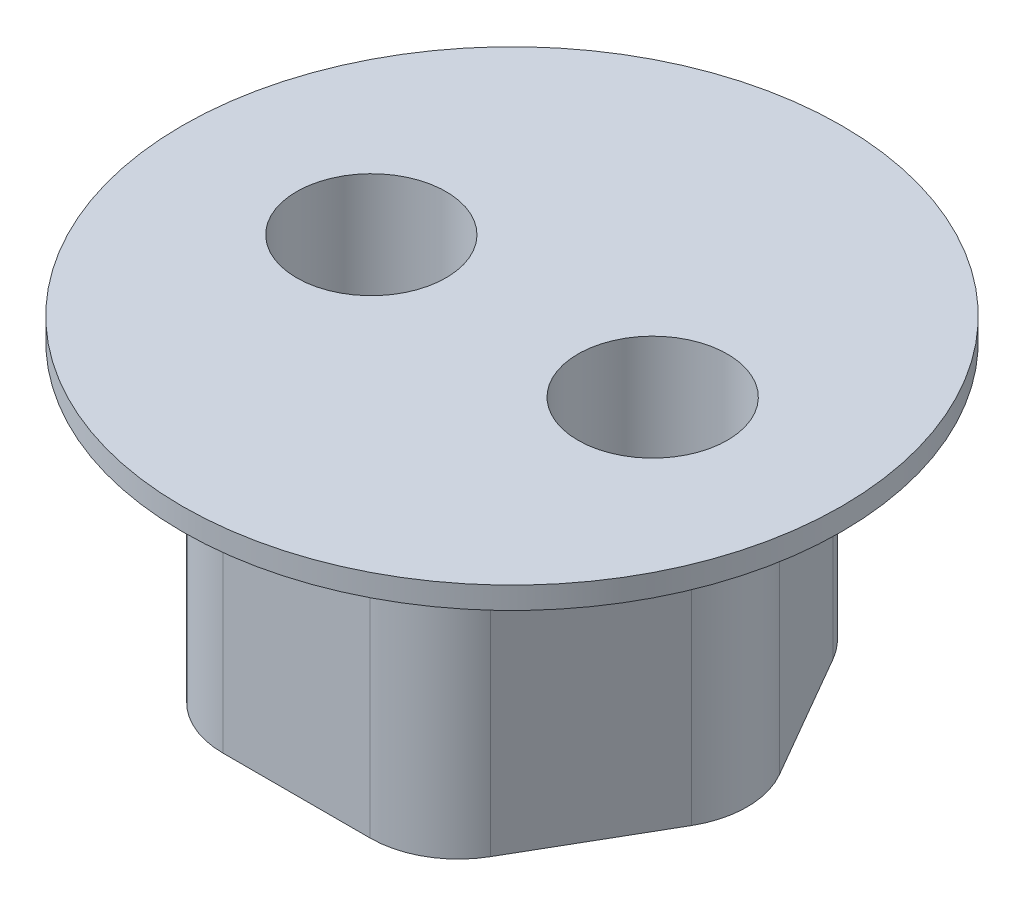
ISO-10303-21;
HEADER;
FILE_DESCRIPTION(('STEP AP214'),'2;1');
FILE_NAME('part.step','',(''),(''),'','','');
FILE_SCHEMA(('AUTOMOTIVE_DESIGN { 1 0 10303 214 1 1 1 1 }'));
ENDSEC;
DATA;
#1=APPLICATION_CONTEXT('core data for automotive mechanical design processes');
#2=APPLICATION_PROTOCOL_DEFINITION('international standard','automotive_design',2000,#1);
#3=PRODUCT_CONTEXT('',#1,'mechanical');
#4=PRODUCT('Part','Part','',(#3));
#5=PRODUCT_RELATED_PRODUCT_CATEGORY('part','',(#4));
#6=PRODUCT_DEFINITION_FORMATION('','',#4);
#7=PRODUCT_DEFINITION_CONTEXT('part definition',#1,'design');
#8=PRODUCT_DEFINITION('design','',#6,#7);
#9=PRODUCT_DEFINITION_SHAPE('','',#8);
#10=(LENGTH_UNIT() NAMED_UNIT(*) SI_UNIT(.MILLI.,.METRE.));
#11=(NAMED_UNIT(*) PLANE_ANGLE_UNIT() SI_UNIT($,.RADIAN.));
#12=(NAMED_UNIT(*) SI_UNIT($,.STERADIAN.) SOLID_ANGLE_UNIT());
#13=UNCERTAINTY_MEASURE_WITH_UNIT(LENGTH_MEASURE(1.E-05),#10,'distance_accuracy_value','');
#14=(GEOMETRIC_REPRESENTATION_CONTEXT(3) GLOBAL_UNCERTAINTY_ASSIGNED_CONTEXT((#13)) GLOBAL_UNIT_ASSIGNED_CONTEXT((#10,
#11,#12)) REPRESENTATION_CONTEXT('',''));
#15=CARTESIAN_POINT('',(0.,0.,0.));
#16=DIRECTION('',(0.,0.,1.));
#17=DIRECTION('',(1.,0.,0.));
#18=AXIS2_PLACEMENT_3D('',#15,#16,#17);
#19=CARTESIAN_POINT('',(3.59285072516712,8.255,6.22299999999996));
#20=DIRECTION('',(-0.866025403784442,0.,-0.499999999999995));
#21=DIRECTION('',(-0.499999999999995,0.,0.866025403784441));
#22=AXIS2_PLACEMENT_3D('',#19,#20,#21);
#23=PLANE('',#22);
#24=DIRECTION('',(0.499999999999995,0.,-0.866025403784441));
#25=VECTOR('',#24,1.);
#26=CARTESIAN_POINT('',(3.59285072516712,0.,6.22299999999996));
#27=LINE('',#26,#25);
#28=CARTESIAN_POINT('',(4.32608556703793,0.,4.95299999999997));
#29=VERTEX_POINT('',#28);
#30=CARTESIAN_POINT('',(6.45246660846327,0.,1.27));
#31=VERTEX_POINT('',#30);
#32=EDGE_CURVE('E169',#29,#31,#27,.T.);
#33=ORIENTED_EDGE('',*,*,#32,.T.);
#34=DIRECTION('',(0.,-1.,0.));
#35=VECTOR('',#34,1.);
#36=CARTESIAN_POINT('',(6.45246660846327,8.255,1.27));
#37=LINE('',#36,#35);
#38=CARTESIAN_POINT('',(6.45246660846327,8.255,1.27));
#39=VERTEX_POINT('',#38);
#40=EDGE_CURVE('E215',#31,#39,#37,.F.);
#41=ORIENTED_EDGE('',*,*,#40,.T.);
#42=DIRECTION('',(0.499999999999995,0.,-0.866025403784441));
#43=VECTOR('',#42,1.);
#44=CARTESIAN_POINT('',(3.59285072516712,8.255,6.22299999999996));
#45=LINE('',#44,#43);
#46=CARTESIAN_POINT('',(4.32608556703793,8.255,4.95299999999997));
#47=VERTEX_POINT('',#46);
#48=EDGE_CURVE('E180',#47,#39,#45,.T.);
#49=ORIENTED_EDGE('',*,*,#48,.F.);
#50=DIRECTION('',(0.,-1.,0.));
#51=VECTOR('',#50,1.);
#52=CARTESIAN_POINT('',(4.32608556703793,8.255,4.95299999999997));
#53=LINE('',#52,#51);
#54=EDGE_CURVE('E211',#47,#29,#53,.T.);
#55=ORIENTED_EDGE('',*,*,#54,.T.);
#56=EDGE_LOOP('',(#33,#41,#49,#55));
#57=FACE_BOUND('',#56,.T.);
#58=ADVANCED_FACE('F43',(#57),#23,.F.);
#59=CARTESIAN_POINT('',(7.18570145033409,8.255,0.));
#60=DIRECTION('',(-0.866025403784438,0.,0.500000000000001));
#61=DIRECTION('',(0.500000000000001,0.,0.866025403784438));
#62=AXIS2_PLACEMENT_3D('',#59,#60,#61);
#63=PLANE('',#62);
#64=DIRECTION('',(-0.500000000000001,0.,-0.866025403784438));
#65=VECTOR('',#64,1.);
#66=CARTESIAN_POINT('',(7.18570145033409,0.,0.));
#67=LINE('',#66,#65);
#68=CARTESIAN_POINT('',(6.45246660846326,0.,-1.26999999999999));
#69=VERTEX_POINT('',#68);
#70=CARTESIAN_POINT('',(4.32608556703786,0.,-4.95300000000001));
#71=VERTEX_POINT('',#70);
#72=EDGE_CURVE('E163',#69,#71,#67,.T.);
#73=ORIENTED_EDGE('',*,*,#72,.T.);
#74=DIRECTION('',(0.,-1.,0.));
#75=VECTOR('',#74,1.);
#76=CARTESIAN_POINT('',(4.32608556703786,8.255,-4.95300000000001));
#77=LINE('',#76,#75);
#78=CARTESIAN_POINT('',(4.32608556703786,8.255,-4.95300000000001));
#79=VERTEX_POINT('',#78);
#80=EDGE_CURVE('E138',#71,#79,#77,.F.);
#81=ORIENTED_EDGE('',*,*,#80,.T.);
#82=DIRECTION('',(-0.500000000000001,0.,-0.866025403784438));
#83=VECTOR('',#82,1.);
#84=CARTESIAN_POINT('',(7.18570145033409,8.255,0.));
#85=LINE('',#84,#83);
#86=CARTESIAN_POINT('',(6.45246660846326,8.255,-1.26999999999999));
#87=VERTEX_POINT('',#86);
#88=EDGE_CURVE('E262',#87,#79,#85,.T.);
#89=ORIENTED_EDGE('',*,*,#88,.F.);
#90=DIRECTION('',(0.,-1.,0.));
#91=VECTOR('',#90,1.);
#92=CARTESIAN_POINT('',(6.45246660846326,8.255,-1.26999999999999));
#93=LINE('',#92,#91);
#94=EDGE_CURVE('E144',#87,#69,#93,.T.);
#95=ORIENTED_EDGE('',*,*,#94,.T.);
#96=EDGE_LOOP('',(#73,#81,#89,#95));
#97=FACE_BOUND('',#96,.T.);
#98=ADVANCED_FACE('F311',(#97),#63,.F.);
#99=CARTESIAN_POINT('',(3.59285072516703,8.255,-6.22300000000001));
#100=DIRECTION('',(0.,0.,1.));
#101=DIRECTION('',(1.,0.,0.));
#102=AXIS2_PLACEMENT_3D('',#99,#100,#101);
#103=PLANE('',#102);
#104=DIRECTION('',(-1.,0.,0.));
#105=VECTOR('',#104,1.);
#106=CARTESIAN_POINT('',(3.59285072516703,8.255,-6.22300000000001));
#107=LINE('',#106,#105);
#108=CARTESIAN_POINT('',(2.12638104142538,8.255,-6.22300000000001));
#109=VERTEX_POINT('',#108);
#110=CARTESIAN_POINT('',(-2.12638104142542,8.255,-6.22299999999999));
#111=VERTEX_POINT('',#110);
#112=EDGE_CURVE('E153',#109,#111,#107,.T.);
#113=ORIENTED_EDGE('',*,*,#112,.F.);
#114=DIRECTION('',(0.,-1.,0.));
#115=VECTOR('',#114,1.);
#116=CARTESIAN_POINT('',(2.12638104142538,8.255,-6.22300000000001));
#117=LINE('',#116,#115);
#118=CARTESIAN_POINT('',(2.12638104142538,0.,-6.22300000000001));
#119=VERTEX_POINT('',#118);
#120=EDGE_CURVE('E137',#109,#119,#117,.T.);
#121=ORIENTED_EDGE('',*,*,#120,.T.);
#122=DIRECTION('',(-1.,0.,0.));
#123=VECTOR('',#122,1.);
#124=CARTESIAN_POINT('',(3.59285072516703,0.,-6.22300000000001));
#125=LINE('',#124,#123);
#126=CARTESIAN_POINT('',(-2.12638104142542,0.,-6.22299999999999));
#127=VERTEX_POINT('',#126);
#128=EDGE_CURVE('E151',#119,#127,#125,.T.);
#129=ORIENTED_EDGE('',*,*,#128,.T.);
#130=DIRECTION('',(0.,-1.,0.));
#131=VECTOR('',#130,1.);
#132=CARTESIAN_POINT('',(-2.12638104142542,8.255,-6.22299999999999));
#133=LINE('',#132,#131);
#134=EDGE_CURVE('E156',#127,#111,#133,.F.);
#135=ORIENTED_EDGE('',*,*,#134,.T.);
#136=EDGE_LOOP('',(#113,#121,#129,#135));
#137=FACE_BOUND('',#136,.T.);
#138=ADVANCED_FACE('F150',(#137),#103,.F.);
#139=CARTESIAN_POINT('',(-3.59285072516707,8.255,-6.22299999999999));
#140=DIRECTION('',(0.866025403784442,0.,0.499999999999995));
#141=DIRECTION('',(0.499999999999995,0.,-0.866025403784442));
#142=AXIS2_PLACEMENT_3D('',#139,#140,#141);
#143=PLANE('',#142);
#144=DIRECTION('',(-0.499999999999995,0.,0.866025403784442));
#145=VECTOR('',#144,1.);
#146=CARTESIAN_POINT('',(-3.59285072516707,8.255,-6.22299999999999));
#147=LINE('',#146,#145);
#148=CARTESIAN_POINT('',(-4.32608556703789,8.255,-4.95299999999998));
#149=VERTEX_POINT('',#148);
#150=CARTESIAN_POINT('',(-6.45246660846327,8.255,-1.26999999999996));
#151=VERTEX_POINT('',#150);
#152=EDGE_CURVE('E257',#149,#151,#147,.T.);
#153=ORIENTED_EDGE('',*,*,#152,.F.);
#154=DIRECTION('',(0.,-1.,0.));
#155=VECTOR('',#154,1.);
#156=CARTESIAN_POINT('',(-4.32608556703789,8.255,-4.95299999999998));
#157=LINE('',#156,#155);
#158=CARTESIAN_POINT('',(-4.32608556703789,0.,-4.95299999999998));
#159=VERTEX_POINT('',#158);
#160=EDGE_CURVE('E234',#149,#159,#157,.T.);
#161=ORIENTED_EDGE('',*,*,#160,.T.);
#162=DIRECTION('',(-0.499999999999995,0.,0.866025403784442));
#163=VECTOR('',#162,1.);
#164=CARTESIAN_POINT('',(-3.59285072516707,0.,-6.22299999999999));
#165=LINE('',#164,#163);
#166=CARTESIAN_POINT('',(-6.45246660846327,0.,-1.26999999999996));
#167=VERTEX_POINT('',#166);
#168=EDGE_CURVE('E162',#159,#167,#165,.T.);
#169=ORIENTED_EDGE('',*,*,#168,.T.);
#170=DIRECTION('',(0.,-1.,0.));
#171=VECTOR('',#170,1.);
#172=CARTESIAN_POINT('',(-6.45246660846327,8.255,-1.26999999999996));
#173=LINE('',#172,#171);
#174=EDGE_CURVE('E59',#167,#151,#173,.F.);
#175=ORIENTED_EDGE('',*,*,#174,.T.);
#176=EDGE_LOOP('',(#153,#161,#169,#175));
#177=FACE_BOUND('',#176,.T.);
#178=ADVANCED_FACE('F338',(#177),#143,.F.);
#179=CARTESIAN_POINT('',(-7.18570145033409,8.255,0.));
#180=DIRECTION('',(0.866025403784435,0.,-0.500000000000007));
#181=DIRECTION('',(-0.500000000000007,0.,-0.866025403784435));
#182=AXIS2_PLACEMENT_3D('',#179,#180,#181);
#183=PLANE('',#182);
#184=DIRECTION('',(0.500000000000007,0.,0.866025403784435));
#185=VECTOR('',#184,1.);
#186=CARTESIAN_POINT('',(-7.18570145033409,0.,0.));
#187=LINE('',#186,#185);
#188=CARTESIAN_POINT('',(-6.45246660846325,0.,1.27000000000005));
#189=VERTEX_POINT('',#188);
#190=CARTESIAN_POINT('',(-4.32608556703782,0.,4.95300000000004));
#191=VERTEX_POINT('',#190);
#192=EDGE_CURVE('E167',#189,#191,#187,.T.);
#193=ORIENTED_EDGE('',*,*,#192,.T.);
#194=DIRECTION('',(0.,-1.,0.));
#195=VECTOR('',#194,1.);
#196=CARTESIAN_POINT('',(-4.32608556703782,8.255,4.95300000000004));
#197=LINE('',#196,#195);
#198=CARTESIAN_POINT('',(-4.32608556703782,8.255,4.95300000000004));
#199=VERTEX_POINT('',#198);
#200=EDGE_CURVE('E229',#191,#199,#197,.F.);
#201=ORIENTED_EDGE('',*,*,#200,.T.);
#202=DIRECTION('',(0.500000000000007,0.,0.866025403784435));
#203=VECTOR('',#202,1.);
#204=CARTESIAN_POINT('',(-7.18570145033409,8.255,0.));
#205=LINE('',#204,#203);
#206=CARTESIAN_POINT('',(-6.45246660846325,8.255,1.27000000000005));
#207=VERTEX_POINT('',#206);
#208=EDGE_CURVE('E253',#207,#199,#205,.T.);
#209=ORIENTED_EDGE('',*,*,#208,.F.);
#210=DIRECTION('',(0.,-1.,0.));
#211=VECTOR('',#210,1.);
#212=CARTESIAN_POINT('',(-6.45246660846325,8.255,1.27000000000005));
#213=LINE('',#212,#211);
#214=EDGE_CURVE('E225',#207,#189,#213,.T.);
#215=ORIENTED_EDGE('',*,*,#214,.T.);
#216=EDGE_LOOP('',(#193,#201,#209,#215));
#217=FACE_BOUND('',#216,.T.);
#218=ADVANCED_FACE('F344',(#217),#183,.F.);
#219=CARTESIAN_POINT('',(-3.59285072516699,8.255,6.22300000000004));
#220=DIRECTION('',(0.,0.,-1.));
#221=DIRECTION('',(-1.,0.,0.));
#222=AXIS2_PLACEMENT_3D('',#219,#220,#221);
#223=PLANE('',#222);
#224=DIRECTION('',(1.,0.,0.));
#225=VECTOR('',#224,1.);
#226=CARTESIAN_POINT('',(-3.59285072516699,0.,6.22300000000004));
#227=LINE('',#226,#225);
#228=CARTESIAN_POINT('',(-2.12638104142533,0.,6.22300000000002));
#229=VERTEX_POINT('',#228);
#230=CARTESIAN_POINT('',(2.12638104142547,0.,6.22299999999998));
#231=VERTEX_POINT('',#230);
#232=EDGE_CURVE('E176',#229,#231,#227,.T.);
#233=ORIENTED_EDGE('',*,*,#232,.T.);
#234=DIRECTION('',(0.,-1.,0.));
#235=VECTOR('',#234,1.);
#236=CARTESIAN_POINT('',(2.12638104142547,8.255,6.22299999999998));
#237=LINE('',#236,#235);
#238=CARTESIAN_POINT('',(2.12638104142547,8.255,6.22299999999998));
#239=VERTEX_POINT('',#238);
#240=EDGE_CURVE('E222',#231,#239,#237,.F.);
#241=ORIENTED_EDGE('',*,*,#240,.T.);
#242=DIRECTION('',(1.,0.,0.));
#243=VECTOR('',#242,1.);
#244=CARTESIAN_POINT('',(-3.59285072516699,8.255,6.22300000000004));
#245=LINE('',#244,#243);
#246=CARTESIAN_POINT('',(-2.12638104142533,8.255,6.22300000000002));
#247=VERTEX_POINT('',#246);
#248=EDGE_CURVE('E192',#247,#239,#245,.T.);
#249=ORIENTED_EDGE('',*,*,#248,.F.);
#250=DIRECTION('',(0.,-1.,0.));
#251=VECTOR('',#250,1.);
#252=CARTESIAN_POINT('',(-2.12638104142533,8.255,6.22300000000002));
#253=LINE('',#252,#251);
#254=EDGE_CURVE('E218',#247,#229,#253,.T.);
#255=ORIENTED_EDGE('',*,*,#254,.T.);
#256=EDGE_LOOP('',(#233,#241,#249,#255));
#257=FACE_BOUND('',#256,.T.);
#258=ADVANCED_FACE('F352',(#257),#223,.F.);
#259=CARTESIAN_POINT('',(0.,0.,0.));
#260=DIRECTION('',(0.,1.,0.));
#261=DIRECTION('',(0.,0.,1.));
#262=AXIS2_PLACEMENT_3D('',#259,#260,#261);
#263=PLANE('',#262);
#264=CARTESIAN_POINT('',(-4.06400000000001,0.,0.));
#265=DIRECTION('',(0.,1.,0.));
#266=DIRECTION('',(0.,0.,1.));
#267=AXIS2_PLACEMENT_3D('',#264,#265,#266);
#268=CIRCLE('',#267,2.159);
#269=CARTESIAN_POINT('',(-4.06400000000001,0.,2.15899999999995));
#270=VERTEX_POINT('',#269);
#271=EDGE_CURVE('E186',#270,#270,#268,.T.);
#272=ORIENTED_EDGE('',*,*,#271,.T.);
#273=EDGE_LOOP('',(#272));
#274=FACE_BOUND('',#273,.T.);
#275=CARTESIAN_POINT('',(4.06399999999998,0.,0.));
#276=DIRECTION('',(0.,1.,0.));
#277=DIRECTION('',(0.,0.,1.));
#278=AXIS2_PLACEMENT_3D('',#275,#276,#277);
#279=CIRCLE('',#278,2.159);
#280=CARTESIAN_POINT('',(4.06399999999998,0.,2.15899999999995));
#281=VERTEX_POINT('',#280);
#282=EDGE_CURVE('E286',#281,#281,#279,.T.);
#283=ORIENTED_EDGE('',*,*,#282,.T.);
#284=EDGE_LOOP('',(#283));
#285=FACE_BOUND('',#284,.T.);
#286=ORIENTED_EDGE('',*,*,#128,.F.);
#287=CARTESIAN_POINT('',(2.12638104142538,0.,-3.68300000000001));
#288=DIRECTION('',(0.,1.,0.));
#289=DIRECTION('',(0.,0.,1.));
#290=AXIS2_PLACEMENT_3D('',#287,#288,#289);
#291=CIRCLE('',#290,2.54);
#292=EDGE_CURVE('E133',#119,#71,#291,.F.);
#293=ORIENTED_EDGE('',*,*,#292,.T.);
#294=ORIENTED_EDGE('',*,*,#72,.F.);
#295=CARTESIAN_POINT('',(4.25276208285079,0.,0.));
#296=DIRECTION('',(0.,1.,0.));
#297=DIRECTION('',(0.,0.,1.));
#298=AXIS2_PLACEMENT_3D('',#295,#296,#297);
#299=CIRCLE('',#298,2.54);
#300=EDGE_CURVE('E145',#69,#31,#299,.F.);
#301=ORIENTED_EDGE('',*,*,#300,.T.);
#302=ORIENTED_EDGE('',*,*,#32,.F.);
#303=CARTESIAN_POINT('',(2.12638104142545,0.,3.68299999999998));
#304=DIRECTION('',(0.,1.,0.));
#305=DIRECTION('',(0.,0.,1.));
#306=AXIS2_PLACEMENT_3D('',#303,#304,#305);
#307=CIRCLE('',#306,2.54);
#308=EDGE_CURVE('E201',#29,#231,#307,.F.);
#309=ORIENTED_EDGE('',*,*,#308,.T.);
#310=ORIENTED_EDGE('',*,*,#232,.F.);
#311=CARTESIAN_POINT('',(-2.12638104142536,0.,3.68300000000002));
#312=DIRECTION('',(0.,1.,0.));
#313=DIRECTION('',(0.,0.,1.));
#314=AXIS2_PLACEMENT_3D('',#311,#312,#313);
#315=CIRCLE('',#314,2.54);
#316=EDGE_CURVE('E198',#229,#191,#315,.F.);
#317=ORIENTED_EDGE('',*,*,#316,.T.);
#318=ORIENTED_EDGE('',*,*,#192,.F.);
#319=CARTESIAN_POINT('',(-4.25276208285078,0.,0.));
#320=DIRECTION('',(0.,1.,0.));
#321=DIRECTION('',(0.,0.,1.));
#322=AXIS2_PLACEMENT_3D('',#319,#320,#321);
#323=CIRCLE('',#322,2.54);
#324=EDGE_CURVE('E155',#189,#167,#323,.F.);
#325=ORIENTED_EDGE('',*,*,#324,.T.);
#326=ORIENTED_EDGE('',*,*,#168,.F.);
#327=CARTESIAN_POINT('',(-2.12638104142541,0.,-3.68299999999999));
#328=DIRECTION('',(0.,1.,0.));
#329=DIRECTION('',(0.,0.,1.));
#330=AXIS2_PLACEMENT_3D('',#327,#328,#329);
#331=CIRCLE('',#330,2.54);
#332=EDGE_CURVE('E160',#159,#127,#331,.F.);
#333=ORIENTED_EDGE('',*,*,#332,.T.);
#334=EDGE_LOOP('',(#286,#293,#294,#301,#302,#309,#310,#317,#318,#325,#326,#333));
#335=FACE_BOUND('',#334,.T.);
#336=ADVANCED_FACE('F158',(#274,#285,#335),#263,.F.);
#337=CARTESIAN_POINT('',(0.,8.255,0.));
#338=DIRECTION('',(0.,1.,0.));
#339=DIRECTION('',(0.,0.,1.));
#340=AXIS2_PLACEMENT_3D('',#337,#338,#339);
#341=PLANE('',#340);
#342=CARTESIAN_POINT('',(0.,8.255,0.));
#343=DIRECTION('',(0.,1.,0.));
#344=DIRECTION('',(0.,0.,1.));
#345=AXIS2_PLACEMENT_3D('',#342,#343,#344);
#346=CIRCLE('',#345,9.525);
#347=CARTESIAN_POINT('',(0.,8.255,9.525));
#348=VERTEX_POINT('',#347);
#349=EDGE_CURVE('E190',#348,#348,#346,.T.);
#350=ORIENTED_EDGE('',*,*,#349,.F.);
#351=EDGE_LOOP('',(#350));
#352=FACE_BOUND('',#351,.T.);
#353=ORIENTED_EDGE('',*,*,#208,.T.);
#354=CARTESIAN_POINT('',(-2.12638104142536,8.255,3.68300000000002));
#355=DIRECTION('',(0.,1.,0.));
#356=DIRECTION('',(0.,0.,1.));
#357=AXIS2_PLACEMENT_3D('',#354,#355,#356);
#358=CIRCLE('',#357,2.54);
#359=EDGE_CURVE('E247',#199,#247,#358,.T.);
#360=ORIENTED_EDGE('',*,*,#359,.T.);
#361=ORIENTED_EDGE('',*,*,#248,.T.);
#362=CARTESIAN_POINT('',(2.12638104142545,8.255,3.68299999999998));
#363=DIRECTION('',(0.,1.,0.));
#364=DIRECTION('',(0.,0.,1.));
#365=AXIS2_PLACEMENT_3D('',#362,#363,#364);
#366=CIRCLE('',#365,2.54);
#367=EDGE_CURVE('E244',#239,#47,#366,.T.);
#368=ORIENTED_EDGE('',*,*,#367,.T.);
#369=ORIENTED_EDGE('',*,*,#48,.T.);
#370=CARTESIAN_POINT('',(4.25276208285079,8.255,0.));
#371=DIRECTION('',(0.,1.,0.));
#372=DIRECTION('',(0.,0.,1.));
#373=AXIS2_PLACEMENT_3D('',#370,#371,#372);
#374=CIRCLE('',#373,2.54);
#375=EDGE_CURVE('E241',#39,#87,#374,.T.);
#376=ORIENTED_EDGE('',*,*,#375,.T.);
#377=ORIENTED_EDGE('',*,*,#88,.T.);
#378=CARTESIAN_POINT('',(2.12638104142538,8.255,-3.68300000000001));
#379=DIRECTION('',(0.,1.,0.));
#380=DIRECTION('',(0.,0.,1.));
#381=AXIS2_PLACEMENT_3D('',#378,#379,#380);
#382=CIRCLE('',#381,2.54);
#383=EDGE_CURVE('E238',#79,#109,#382,.T.);
#384=ORIENTED_EDGE('',*,*,#383,.T.);
#385=ORIENTED_EDGE('',*,*,#112,.T.);
#386=CARTESIAN_POINT('',(-2.12638104142541,8.255,-3.68299999999999));
#387=DIRECTION('',(0.,1.,0.));
#388=DIRECTION('',(0.,0.,1.));
#389=AXIS2_PLACEMENT_3D('',#386,#387,#388);
#390=CIRCLE('',#389,2.54);
#391=EDGE_CURVE('E52',#111,#149,#390,.T.);
#392=ORIENTED_EDGE('',*,*,#391,.T.);
#393=ORIENTED_EDGE('',*,*,#152,.T.);
#394=CARTESIAN_POINT('',(-4.25276208285078,8.255,0.));
#395=DIRECTION('',(0.,1.,0.));
#396=DIRECTION('',(0.,0.,1.));
#397=AXIS2_PLACEMENT_3D('',#394,#395,#396);
#398=CIRCLE('',#397,2.54);
#399=EDGE_CURVE('E11',#151,#207,#398,.T.);
#400=ORIENTED_EDGE('',*,*,#399,.T.);
#401=EDGE_LOOP('',(#353,#360,#361,#368,#369,#376,#377,#384,#385,#392,#393,#400));
#402=FACE_BOUND('',#401,.T.);
#403=ADVANCED_FACE('F347',(#352,#402),#341,.F.);
#404=CARTESIAN_POINT('',(0.,8.89,0.));
#405=DIRECTION('',(0.,-1.,0.));
#406=DIRECTION('',(0.,0.,-1.));
#407=AXIS2_PLACEMENT_3D('',#404,#405,#406);
#408=CYLINDRICAL_SURFACE('',#407,9.525);
#409=CARTESIAN_POINT('',(0.,8.89,0.));
#410=DIRECTION('',(0.,1.,0.));
#411=DIRECTION('',(0.,0.,1.));
#412=AXIS2_PLACEMENT_3D('',#409,#410,#411);
#413=CIRCLE('',#412,9.525);
#414=CARTESIAN_POINT('',(0.,8.89,9.525));
#415=VERTEX_POINT('',#414);
#416=EDGE_CURVE('E275',#415,#415,#413,.T.);
#417=ORIENTED_EDGE('',*,*,#416,.F.);
#418=EDGE_LOOP('',(#417));
#419=FACE_BOUND('',#418,.T.);
#420=ORIENTED_EDGE('',*,*,#349,.T.);
#421=EDGE_LOOP('',(#420));
#422=FACE_BOUND('',#421,.T.);
#423=ADVANCED_FACE('F404',(#419,#422),#408,.T.);
#424=CARTESIAN_POINT('',(0.,8.89,0.));
#425=DIRECTION('',(0.,1.,0.));
#426=DIRECTION('',(0.,0.,1.));
#427=AXIS2_PLACEMENT_3D('',#424,#425,#426);
#428=PLANE('',#427);
#429=CARTESIAN_POINT('',(-4.06400000000001,8.89,0.));
#430=DIRECTION('',(0.,1.,0.));
#431=DIRECTION('',(0.,0.,1.));
#432=AXIS2_PLACEMENT_3D('',#429,#430,#431);
#433=CIRCLE('',#432,2.159);
#434=CARTESIAN_POINT('',(-4.06400000000001,8.89,2.15899999999995));
#435=VERTEX_POINT('',#434);
#436=EDGE_CURVE('E185',#435,#435,#433,.T.);
#437=ORIENTED_EDGE('',*,*,#436,.F.);
#438=EDGE_LOOP('',(#437));
#439=FACE_BOUND('',#438,.T.);
#440=CARTESIAN_POINT('',(4.06399999999998,8.89,0.));
#441=DIRECTION('',(0.,1.,0.));
#442=DIRECTION('',(0.,0.,1.));
#443=AXIS2_PLACEMENT_3D('',#440,#441,#442);
#444=CIRCLE('',#443,2.159);
#445=CARTESIAN_POINT('',(4.06399999999998,8.89,2.15899999999995));
#446=VERTEX_POINT('',#445);
#447=EDGE_CURVE('E181',#446,#446,#444,.T.);
#448=ORIENTED_EDGE('',*,*,#447,.F.);
#449=EDGE_LOOP('',(#448));
#450=FACE_BOUND('',#449,.T.);
#451=ORIENTED_EDGE('',*,*,#416,.T.);
#452=EDGE_LOOP('',(#451));
#453=FACE_BOUND('',#452,.T.);
#454=ADVANCED_FACE('F307',(#439,#450,#453),#428,.T.);
#455=CARTESIAN_POINT('',(4.06399999999998,0.,0.));
#456=DIRECTION('',(0.,1.,0.));
#457=DIRECTION('',(0.,0.,1.));
#458=AXIS2_PLACEMENT_3D('',#455,#456,#457);
#459=CYLINDRICAL_SURFACE('',#458,2.159);
#460=CARTESIAN_POINT('',(4.06399999999998,8.89,2.15899999999995));
#461=CARTESIAN_POINT('',(4.06399999999998,8.79739583333333,2.15899999999995));
#462=CARTESIAN_POINT('',(4.06399999999998,8.70479166666667,2.15899999999995));
#463=CARTESIAN_POINT('',(4.06399999999998,8.51958333333333,2.15899999999995));
#464=CARTESIAN_POINT('',(4.06399999999998,8.42697916666667,2.15899999999995));
#465=CARTESIAN_POINT('',(4.06399999999998,8.24177083333333,2.15899999999995));
#466=CARTESIAN_POINT('',(4.06399999999998,8.14916666666667,2.15899999999995));
#467=CARTESIAN_POINT('',(4.06399999999998,7.96395833333333,2.15899999999995));
#468=CARTESIAN_POINT('',(4.06399999999998,7.87135416666667,2.15899999999995));
#469=CARTESIAN_POINT('',(4.06399999999998,7.68614583333333,2.15899999999995));
#470=CARTESIAN_POINT('',(4.06399999999998,7.59354166666667,2.15899999999995));
#471=CARTESIAN_POINT('',(4.06399999999998,7.40833333333333,2.15899999999995));
#472=CARTESIAN_POINT('',(4.06399999999998,7.31572916666667,2.15899999999995));
#473=CARTESIAN_POINT('',(4.06399999999998,7.13052083333333,2.15899999999995));
#474=CARTESIAN_POINT('',(4.06399999999998,7.03791666666667,2.15899999999995));
#475=CARTESIAN_POINT('',(4.06399999999998,6.85270833333333,2.15899999999995));
#476=CARTESIAN_POINT('',(4.06399999999998,6.76010416666667,2.15899999999995));
#477=CARTESIAN_POINT('',(4.06399999999998,6.57489583333333,2.15899999999995));
#478=CARTESIAN_POINT('',(4.06399999999998,6.48229166666667,2.15899999999995));
#479=CARTESIAN_POINT('',(4.06399999999998,6.29708333333333,2.15899999999995));
#480=CARTESIAN_POINT('',(4.06399999999998,6.20447916666667,2.15899999999995));
#481=CARTESIAN_POINT('',(4.06399999999998,6.01927083333333,2.15899999999995));
#482=CARTESIAN_POINT('',(4.06399999999998,5.92666666666667,2.15899999999995));
#483=CARTESIAN_POINT('',(4.06399999999998,5.74145833333333,2.15899999999995));
#484=CARTESIAN_POINT('',(4.06399999999998,5.64885416666667,2.15899999999995));
#485=CARTESIAN_POINT('',(4.06399999999998,5.46364583333333,2.15899999999995));
#486=CARTESIAN_POINT('',(4.06399999999998,5.37104166666667,2.15899999999995));
#487=CARTESIAN_POINT('',(4.06399999999998,5.18583333333333,2.15899999999995));
#488=CARTESIAN_POINT('',(4.06399999999998,5.09322916666667,2.15899999999995));
#489=CARTESIAN_POINT('',(4.06399999999998,4.90802083333333,2.15899999999995));
#490=CARTESIAN_POINT('',(4.06399999999998,4.81541666666667,2.15899999999995));
#491=CARTESIAN_POINT('',(4.06399999999998,4.63020833333333,2.15899999999995));
#492=CARTESIAN_POINT('',(4.06399999999998,4.53760416666667,2.15899999999995));
#493=CARTESIAN_POINT('',(4.06399999999998,4.35239583333333,2.15899999999995));
#494=CARTESIAN_POINT('',(4.06399999999998,4.25979166666667,2.15899999999995));
#495=CARTESIAN_POINT('',(4.06399999999998,4.07458333333333,2.15899999999995));
#496=CARTESIAN_POINT('',(4.06399999999998,3.98197916666667,2.15899999999995));
#497=CARTESIAN_POINT('',(4.06399999999998,3.79677083333333,2.15899999999995));
#498=CARTESIAN_POINT('',(4.06399999999998,3.70416666666667,2.15899999999995));
#499=CARTESIAN_POINT('',(4.06399999999998,3.51895833333333,2.15899999999995));
#500=CARTESIAN_POINT('',(4.06399999999998,3.42635416666667,2.15899999999995));
#501=CARTESIAN_POINT('',(4.06399999999998,3.24114583333333,2.15899999999995));
#502=CARTESIAN_POINT('',(4.06399999999998,3.14854166666667,2.15899999999995));
#503=CARTESIAN_POINT('',(4.06399999999998,2.96333333333333,2.15899999999995));
#504=CARTESIAN_POINT('',(4.06399999999998,2.87072916666667,2.15899999999995));
#505=CARTESIAN_POINT('',(4.06399999999998,2.68552083333333,2.15899999999995));
#506=CARTESIAN_POINT('',(4.06399999999998,2.59291666666667,2.15899999999995));
#507=CARTESIAN_POINT('',(4.06399999999998,2.40770833333333,2.15899999999995));
#508=CARTESIAN_POINT('',(4.06399999999998,2.31510416666667,2.15899999999995));
#509=CARTESIAN_POINT('',(4.06399999999998,2.12989583333333,2.15899999999995));
#510=CARTESIAN_POINT('',(4.06399999999998,2.03729166666667,2.15899999999995));
#511=CARTESIAN_POINT('',(4.06399999999998,1.85208333333333,2.15899999999995));
#512=CARTESIAN_POINT('',(4.06399999999998,1.75947916666667,2.15899999999995));
#513=CARTESIAN_POINT('',(4.06399999999998,1.57427083333333,2.15899999999995));
#514=CARTESIAN_POINT('',(4.06399999999998,1.48166666666667,2.15899999999995));
#515=CARTESIAN_POINT('',(4.06399999999998,1.29645833333333,2.15899999999995));
#516=CARTESIAN_POINT('',(4.06399999999998,1.20385416666667,2.15899999999995));
#517=CARTESIAN_POINT('',(4.06399999999998,1.01864583333333,2.15899999999995));
#518=CARTESIAN_POINT('',(4.06399999999998,0.926041666666667,2.15899999999995));
#519=CARTESIAN_POINT('',(4.06399999999998,0.740833333333334,2.15899999999995));
#520=CARTESIAN_POINT('',(4.06399999999998,0.648229166666667,2.15899999999995));
#521=CARTESIAN_POINT('',(4.06399999999998,0.463020833333334,2.15899999999995));
#522=CARTESIAN_POINT('',(4.06399999999998,0.370416666666667,2.15899999999995));
#523=CARTESIAN_POINT('',(4.06399999999998,0.185208333333334,2.15899999999995));
#524=CARTESIAN_POINT('',(4.06399999999998,0.0926041666666668,2.15899999999995));
#525=CARTESIAN_POINT('',(4.06399999999998,0.,2.15899999999995));
#526=B_SPLINE_CURVE_WITH_KNOTS('',3,(#460,#461,#462,#463,#464,#465,#466,#467,#468,#469,#470,
#471,#472,#473,#474,#475,#476,#477,#478,#479,#480,#481,#482,#483,#484,#485,#486,#487,#488,#489,
#490,#491,#492,#493,#494,#495,#496,#497,#498,#499,#500,#501,#502,#503,#504,#505,#506,#507,#508,
#509,#510,#511,#512,#513,#514,#515,#516,#517,#518,#519,#520,#521,#522,#523,#524,#525),
.UNSPECIFIED.,.F.,.F.,(4,2,2,2,2,2,2,2,2,2,2,2,2,2,2,2,2,2,2,2,2,2,2,2,2,2,2,2,2,2,2,2,4),(0.,
0.2778125,0.555625000000001,0.833437500000001,1.11125,1.3890625,1.666875,1.9446875,2.2225,
2.5003125,2.778125,3.0559375,3.33375,3.6115625,3.889375,4.1671875,4.445,4.7228125,5.000625,
5.2784375,5.55625,5.8340625,6.111875,6.3896875,6.6675,6.9453125,7.223125,7.5009375,7.77875,
8.0565625,8.334375,8.6121875,8.89),.UNSPECIFIED.);
#527=EDGE_CURVE('BSEAM298',#446,#281,#526,.T.);
#528=ORIENTED_EDGE('',*,*,#447,.T.);
#529=ORIENTED_EDGE('',*,*,#282,.F.);
#530=ORIENTED_EDGE('',*,*,#527,.T.);
#531=ORIENTED_EDGE('',*,*,#527,.F.);
#532=EDGE_LOOP('',(#528,#530,#529,#531));
#533=FACE_BOUND('',#532,.T.);
#534=ADVANCED_FACE('F298',(#533),#459,.F.);
#535=CARTESIAN_POINT('',(-4.06400000000001,0.,0.));
#536=DIRECTION('',(0.,1.,0.));
#537=DIRECTION('',(0.,0.,1.));
#538=AXIS2_PLACEMENT_3D('',#535,#536,#537);
#539=CYLINDRICAL_SURFACE('',#538,2.159);
#540=CARTESIAN_POINT('',(-4.06400000000001,8.89,2.15899999999995));
#541=CARTESIAN_POINT('',(-4.06400000000001,8.79739583333333,2.15899999999995));
#542=CARTESIAN_POINT('',(-4.06400000000001,8.70479166666667,2.15899999999995));
#543=CARTESIAN_POINT('',(-4.06400000000001,8.51958333333333,2.15899999999995));
#544=CARTESIAN_POINT('',(-4.06400000000001,8.42697916666667,2.15899999999995));
#545=CARTESIAN_POINT('',(-4.06400000000001,8.24177083333333,2.15899999999995));
#546=CARTESIAN_POINT('',(-4.06400000000001,8.14916666666667,2.15899999999995));
#547=CARTESIAN_POINT('',(-4.06400000000001,7.96395833333333,2.15899999999995));
#548=CARTESIAN_POINT('',(-4.06400000000001,7.87135416666667,2.15899999999995));
#549=CARTESIAN_POINT('',(-4.06400000000001,7.68614583333333,2.15899999999995));
#550=CARTESIAN_POINT('',(-4.06400000000001,7.59354166666667,2.15899999999995));
#551=CARTESIAN_POINT('',(-4.06400000000001,7.40833333333333,2.15899999999995));
#552=CARTESIAN_POINT('',(-4.06400000000001,7.31572916666667,2.15899999999995));
#553=CARTESIAN_POINT('',(-4.06400000000001,7.13052083333333,2.15899999999995));
#554=CARTESIAN_POINT('',(-4.06400000000001,7.03791666666667,2.15899999999995));
#555=CARTESIAN_POINT('',(-4.06400000000001,6.85270833333333,2.15899999999995));
#556=CARTESIAN_POINT('',(-4.06400000000001,6.76010416666667,2.15899999999995));
#557=CARTESIAN_POINT('',(-4.06400000000001,6.57489583333333,2.15899999999995));
#558=CARTESIAN_POINT('',(-4.06400000000001,6.48229166666667,2.15899999999995));
#559=CARTESIAN_POINT('',(-4.06400000000001,6.29708333333333,2.15899999999995));
#560=CARTESIAN_POINT('',(-4.06400000000001,6.20447916666667,2.15899999999995));
#561=CARTESIAN_POINT('',(-4.06400000000001,6.01927083333333,2.15899999999995));
#562=CARTESIAN_POINT('',(-4.06400000000001,5.92666666666667,2.15899999999995));
#563=CARTESIAN_POINT('',(-4.06400000000001,5.74145833333333,2.15899999999995));
#564=CARTESIAN_POINT('',(-4.06400000000001,5.64885416666667,2.15899999999995));
#565=CARTESIAN_POINT('',(-4.06400000000001,5.46364583333333,2.15899999999995));
#566=CARTESIAN_POINT('',(-4.06400000000001,5.37104166666667,2.15899999999995));
#567=CARTESIAN_POINT('',(-4.06400000000001,5.18583333333333,2.15899999999995));
#568=CARTESIAN_POINT('',(-4.06400000000001,5.09322916666667,2.15899999999995));
#569=CARTESIAN_POINT('',(-4.06400000000001,4.90802083333333,2.15899999999995));
#570=CARTESIAN_POINT('',(-4.06400000000001,4.81541666666667,2.15899999999995));
#571=CARTESIAN_POINT('',(-4.06400000000001,4.63020833333333,2.15899999999995));
#572=CARTESIAN_POINT('',(-4.06400000000001,4.53760416666667,2.15899999999995));
#573=CARTESIAN_POINT('',(-4.06400000000001,4.35239583333333,2.15899999999995));
#574=CARTESIAN_POINT('',(-4.06400000000001,4.25979166666667,2.15899999999995));
#575=CARTESIAN_POINT('',(-4.06400000000001,4.07458333333333,2.15899999999995));
#576=CARTESIAN_POINT('',(-4.06400000000001,3.98197916666667,2.15899999999995));
#577=CARTESIAN_POINT('',(-4.06400000000001,3.79677083333333,2.15899999999995));
#578=CARTESIAN_POINT('',(-4.06400000000001,3.70416666666667,2.15899999999995));
#579=CARTESIAN_POINT('',(-4.06400000000001,3.51895833333333,2.15899999999995));
#580=CARTESIAN_POINT('',(-4.06400000000001,3.42635416666667,2.15899999999995));
#581=CARTESIAN_POINT('',(-4.06400000000001,3.24114583333333,2.15899999999995));
#582=CARTESIAN_POINT('',(-4.06400000000001,3.14854166666667,2.15899999999995));
#583=CARTESIAN_POINT('',(-4.06400000000001,2.96333333333333,2.15899999999995));
#584=CARTESIAN_POINT('',(-4.06400000000001,2.87072916666667,2.15899999999995));
#585=CARTESIAN_POINT('',(-4.06400000000001,2.68552083333333,2.15899999999995));
#586=CARTESIAN_POINT('',(-4.06400000000001,2.59291666666667,2.15899999999995));
#587=CARTESIAN_POINT('',(-4.06400000000001,2.40770833333333,2.15899999999995));
#588=CARTESIAN_POINT('',(-4.06400000000001,2.31510416666667,2.15899999999995));
#589=CARTESIAN_POINT('',(-4.06400000000001,2.12989583333333,2.15899999999995));
#590=CARTESIAN_POINT('',(-4.06400000000001,2.03729166666667,2.15899999999995));
#591=CARTESIAN_POINT('',(-4.06400000000001,1.85208333333333,2.15899999999995));
#592=CARTESIAN_POINT('',(-4.06400000000001,1.75947916666667,2.15899999999995));
#593=CARTESIAN_POINT('',(-4.06400000000001,1.57427083333333,2.15899999999995));
#594=CARTESIAN_POINT('',(-4.06400000000001,1.48166666666667,2.15899999999995));
#595=CARTESIAN_POINT('',(-4.06400000000001,1.29645833333333,2.15899999999995));
#596=CARTESIAN_POINT('',(-4.06400000000001,1.20385416666667,2.15899999999995));
#597=CARTESIAN_POINT('',(-4.06400000000001,1.01864583333333,2.15899999999995));
#598=CARTESIAN_POINT('',(-4.06400000000001,0.926041666666667,2.15899999999995));
#599=CARTESIAN_POINT('',(-4.06400000000001,0.740833333333334,2.15899999999995));
#600=CARTESIAN_POINT('',(-4.06400000000001,0.648229166666667,2.15899999999995));
#601=CARTESIAN_POINT('',(-4.06400000000001,0.463020833333334,2.15899999999995));
#602=CARTESIAN_POINT('',(-4.06400000000001,0.370416666666667,2.15899999999995));
#603=CARTESIAN_POINT('',(-4.06400000000001,0.185208333333334,2.15899999999995));
#604=CARTESIAN_POINT('',(-4.06400000000001,0.0926041666666668,2.15899999999995));
#605=CARTESIAN_POINT('',(-4.06400000000001,0.,2.15899999999995));
#606=B_SPLINE_CURVE_WITH_KNOTS('',3,(#540,#541,#542,#543,#544,#545,#546,#547,#548,#549,#550,
#551,#552,#553,#554,#555,#556,#557,#558,#559,#560,#561,#562,#563,#564,#565,#566,#567,#568,#569,
#570,#571,#572,#573,#574,#575,#576,#577,#578,#579,#580,#581,#582,#583,#584,#585,#586,#587,#588,
#589,#590,#591,#592,#593,#594,#595,#596,#597,#598,#599,#600,#601,#602,#603,#604,#605),
.UNSPECIFIED.,.F.,.F.,(4,2,2,2,2,2,2,2,2,2,2,2,2,2,2,2,2,2,2,2,2,2,2,2,2,2,2,2,2,2,2,2,4),(0.,
0.2778125,0.555625000000001,0.833437500000001,1.11125,1.3890625,1.666875,1.9446875,2.2225,
2.5003125,2.778125,3.0559375,3.33375,3.6115625,3.889375,4.1671875,4.445,4.7228125,5.000625,
5.2784375,5.55625,5.8340625,6.111875,6.3896875,6.6675,6.9453125,7.223125,7.5009375,7.77875,
8.0565625,8.334375,8.6121875,8.89),.UNSPECIFIED.);
#607=EDGE_CURVE('BSEAM296',#435,#270,#606,.T.);
#608=ORIENTED_EDGE('',*,*,#436,.T.);
#609=ORIENTED_EDGE('',*,*,#271,.F.);
#610=ORIENTED_EDGE('',*,*,#607,.T.);
#611=ORIENTED_EDGE('',*,*,#607,.F.);
#612=EDGE_LOOP('',(#608,#610,#609,#611));
#613=FACE_BOUND('',#612,.T.);
#614=ADVANCED_FACE('F296',(#613),#539,.F.);
#615=CARTESIAN_POINT('',(2.12638104142538,8.255,-3.68300000000001));
#616=DIRECTION('',(0.,-1.,0.));
#617=DIRECTION('',(0.,0.,-1.));
#618=AXIS2_PLACEMENT_3D('',#615,#616,#617);
#619=CYLINDRICAL_SURFACE('',#618,2.54);
#620=ORIENTED_EDGE('',*,*,#383,.F.);
#621=ORIENTED_EDGE('',*,*,#80,.F.);
#622=ORIENTED_EDGE('',*,*,#292,.F.);
#623=ORIENTED_EDGE('',*,*,#120,.F.);
#624=EDGE_LOOP('',(#620,#621,#622,#623));
#625=FACE_BOUND('',#624,.T.);
#626=ADVANCED_FACE('F136',(#625),#619,.T.);
#627=CARTESIAN_POINT('',(4.25276208285079,8.255,0.));
#628=DIRECTION('',(0.,-1.,0.));
#629=DIRECTION('',(0.,0.,-1.));
#630=AXIS2_PLACEMENT_3D('',#627,#628,#629);
#631=CYLINDRICAL_SURFACE('',#630,2.54);
#632=ORIENTED_EDGE('',*,*,#375,.F.);
#633=ORIENTED_EDGE('',*,*,#40,.F.);
#634=ORIENTED_EDGE('',*,*,#300,.F.);
#635=ORIENTED_EDGE('',*,*,#94,.F.);
#636=EDGE_LOOP('',(#632,#633,#634,#635));
#637=FACE_BOUND('',#636,.T.);
#638=ADVANCED_FACE('F305',(#637),#631,.T.);
#639=CARTESIAN_POINT('',(2.12638104142545,8.255,3.68299999999998));
#640=DIRECTION('',(0.,-1.,0.));
#641=DIRECTION('',(0.,0.,-1.));
#642=AXIS2_PLACEMENT_3D('',#639,#640,#641);
#643=CYLINDRICAL_SURFACE('',#642,2.54);
#644=ORIENTED_EDGE('',*,*,#367,.F.);
#645=ORIENTED_EDGE('',*,*,#240,.F.);
#646=ORIENTED_EDGE('',*,*,#308,.F.);
#647=ORIENTED_EDGE('',*,*,#54,.F.);
#648=EDGE_LOOP('',(#644,#645,#646,#647));
#649=FACE_BOUND('',#648,.T.);
#650=ADVANCED_FACE('F322',(#649),#643,.T.);
#651=CARTESIAN_POINT('',(-2.12638104142536,8.255,3.68300000000002));
#652=DIRECTION('',(0.,-1.,0.));
#653=DIRECTION('',(0.,0.,-1.));
#654=AXIS2_PLACEMENT_3D('',#651,#652,#653);
#655=CYLINDRICAL_SURFACE('',#654,2.54);
#656=ORIENTED_EDGE('',*,*,#359,.F.);
#657=ORIENTED_EDGE('',*,*,#200,.F.);
#658=ORIENTED_EDGE('',*,*,#316,.F.);
#659=ORIENTED_EDGE('',*,*,#254,.F.);
#660=EDGE_LOOP('',(#656,#657,#658,#659));
#661=FACE_BOUND('',#660,.T.);
#662=ADVANCED_FACE('F326',(#661),#655,.T.);
#663=CARTESIAN_POINT('',(-2.12638104142541,8.255,-3.68299999999999));
#664=DIRECTION('',(0.,-1.,0.));
#665=DIRECTION('',(0.,0.,-1.));
#666=AXIS2_PLACEMENT_3D('',#663,#664,#665);
#667=CYLINDRICAL_SURFACE('',#666,2.54);
#668=ORIENTED_EDGE('',*,*,#391,.F.);
#669=ORIENTED_EDGE('',*,*,#134,.F.);
#670=ORIENTED_EDGE('',*,*,#332,.F.);
#671=ORIENTED_EDGE('',*,*,#160,.F.);
#672=EDGE_LOOP('',(#668,#669,#670,#671));
#673=FACE_BOUND('',#672,.T.);
#674=ADVANCED_FACE('F329',(#673),#667,.T.);
#675=CARTESIAN_POINT('',(-4.25276208285078,8.255,0.));
#676=DIRECTION('',(0.,-1.,0.));
#677=DIRECTION('',(0.,0.,-1.));
#678=AXIS2_PLACEMENT_3D('',#675,#676,#677);
#679=CYLINDRICAL_SURFACE('',#678,2.54);
#680=ORIENTED_EDGE('',*,*,#399,.F.);
#681=ORIENTED_EDGE('',*,*,#174,.F.);
#682=ORIENTED_EDGE('',*,*,#324,.F.);
#683=ORIENTED_EDGE('',*,*,#214,.F.);
#684=EDGE_LOOP('',(#680,#681,#682,#683));
#685=FACE_BOUND('',#684,.T.);
#686=ADVANCED_FACE('F45',(#685),#679,.T.);
#687=CLOSED_SHELL('',(#58,#98,#138,#178,#218,#258,#336,#403,#423,#454,#534,#614,#626,#638,#650,
#662,#674,#686));
#688=MANIFOLD_SOLID_BREP('B2',#687);
#689=ADVANCED_BREP_SHAPE_REPRESENTATION('',(#18,#688),#14);
#690=SHAPE_DEFINITION_REPRESENTATION(#9,#689);
ENDSEC;
END-ISO-10303-21;
